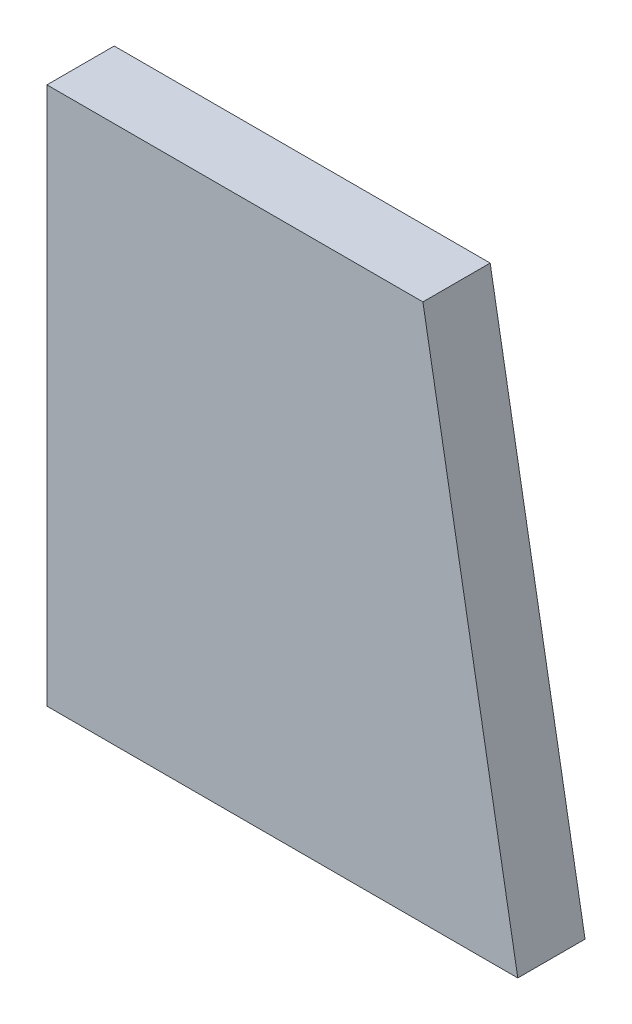
ISO-10303-21;
HEADER;
FILE_DESCRIPTION(('STEP AP214'),'2;1');
FILE_NAME('part.step','',(''),(''),'','','');
FILE_SCHEMA(('AUTOMOTIVE_DESIGN { 1 0 10303 214 1 1 1 1 }'));
ENDSEC;
DATA;
#1=APPLICATION_CONTEXT('core data for automotive mechanical design processes');
#2=APPLICATION_PROTOCOL_DEFINITION('international standard','automotive_design',2000,#1);
#3=PRODUCT_CONTEXT('',#1,'mechanical');
#4=PRODUCT('Part','Part','',(#3));
#5=PRODUCT_RELATED_PRODUCT_CATEGORY('part','',(#4));
#6=PRODUCT_DEFINITION_FORMATION('','',#4);
#7=PRODUCT_DEFINITION_CONTEXT('part definition',#1,'design');
#8=PRODUCT_DEFINITION('design','',#6,#7);
#9=PRODUCT_DEFINITION_SHAPE('','',#8);
#10=(LENGTH_UNIT() NAMED_UNIT(*) SI_UNIT(.MILLI.,.METRE.));
#11=(NAMED_UNIT(*) PLANE_ANGLE_UNIT() SI_UNIT($,.RADIAN.));
#12=(NAMED_UNIT(*) SI_UNIT($,.STERADIAN.) SOLID_ANGLE_UNIT());
#13=UNCERTAINTY_MEASURE_WITH_UNIT(LENGTH_MEASURE(1.E-05),#10,'distance_accuracy_value','');
#14=(GEOMETRIC_REPRESENTATION_CONTEXT(3) GLOBAL_UNCERTAINTY_ASSIGNED_CONTEXT((#13)) GLOBAL_UNIT_ASSIGNED_CONTEXT((#10,
#11,#12)) REPRESENTATION_CONTEXT('',''));
#15=CARTESIAN_POINT('',(0.,0.,0.));
#16=DIRECTION('',(0.,0.,1.));
#17=DIRECTION('',(1.,0.,0.));
#18=AXIS2_PLACEMENT_3D('',#15,#16,#17);
#19=CARTESIAN_POINT('',(-7.05307922833879,40.,5.));
#20=DIRECTION('',(-0.984807753012207,-0.173648177666935,0.));
#21=DIRECTION('',(0.173648177666935,-0.984807753012207,0.));
#22=AXIS2_PLACEMENT_3D('',#19,#20,#21);
#23=PLANE('',#22);
#24=DIRECTION('',(-0.173648177666935,0.984807753012207,0.));
#25=VECTOR('',#24,1.);
#26=CARTESIAN_POINT('',(-7.05307922833879,40.,0.));
#27=LINE('',#26,#25);
#28=CARTESIAN_POINT('',(0.,0.,0.));
#29=VERTEX_POINT('',#28);
#30=CARTESIAN_POINT('',(-7.05307922833879,40.,0.));
#31=VERTEX_POINT('',#30);
#32=EDGE_CURVE('E96',#29,#31,#27,.T.);
#33=ORIENTED_EDGE('',*,*,#32,.T.);
#34=DIRECTION('',(0.,0.,-1.));
#35=VECTOR('',#34,1.);
#36=CARTESIAN_POINT('',(-7.05307922833879,40.,5.));
#37=LINE('',#36,#35);
#38=CARTESIAN_POINT('',(-7.05307922833879,40.,5.));
#39=VERTEX_POINT('',#38);
#40=EDGE_CURVE('E11',#39,#31,#37,.T.);
#41=ORIENTED_EDGE('',*,*,#40,.F.);
#42=DIRECTION('',(-0.173648177666935,0.984807753012207,0.));
#43=VECTOR('',#42,1.);
#44=CARTESIAN_POINT('',(-7.05307922833879,40.,5.));
#45=LINE('',#44,#43);
#46=CARTESIAN_POINT('',(0.,0.,5.));
#47=VERTEX_POINT('',#46);
#48=EDGE_CURVE('E84',#47,#39,#45,.T.);
#49=ORIENTED_EDGE('',*,*,#48,.F.);
#50=DIRECTION('',(0.,0.,-1.));
#51=VECTOR('',#50,1.);
#52=CARTESIAN_POINT('',(0.,0.,5.));
#53=LINE('',#52,#51);
#54=EDGE_CURVE('E92',#47,#29,#53,.T.);
#55=ORIENTED_EDGE('',*,*,#54,.T.);
#56=EDGE_LOOP('',(#33,#41,#49,#55));
#57=FACE_BOUND('',#56,.T.);
#58=ADVANCED_FACE('F33',(#57),#23,.F.);
#59=CARTESIAN_POINT('',(-35.,40.,5.));
#60=DIRECTION('',(0.,-1.,0.));
#61=DIRECTION('',(0.,0.,-1.));
#62=AXIS2_PLACEMENT_3D('',#59,#60,#61);
#63=PLANE('',#62);
#64=DIRECTION('',(-1.,0.,0.));
#65=VECTOR('',#64,1.);
#66=CARTESIAN_POINT('',(-35.,40.,0.));
#67=LINE('',#66,#65);
#68=CARTESIAN_POINT('',(-35.,40.,0.));
#69=VERTEX_POINT('',#68);
#70=EDGE_CURVE('E88',#31,#69,#67,.T.);
#71=ORIENTED_EDGE('',*,*,#70,.T.);
#72=DIRECTION('',(0.,0.,-1.));
#73=VECTOR('',#72,1.);
#74=CARTESIAN_POINT('',(-35.,40.,5.));
#75=LINE('',#74,#73);
#76=CARTESIAN_POINT('',(-35.,40.,5.));
#77=VERTEX_POINT('',#76);
#78=EDGE_CURVE('E41',#77,#69,#75,.T.);
#79=ORIENTED_EDGE('',*,*,#78,.F.);
#80=DIRECTION('',(-1.,0.,0.));
#81=VECTOR('',#80,1.);
#82=CARTESIAN_POINT('',(-35.,40.,5.));
#83=LINE('',#82,#81);
#84=EDGE_CURVE('E79',#39,#77,#83,.T.);
#85=ORIENTED_EDGE('',*,*,#84,.F.);
#86=ORIENTED_EDGE('',*,*,#40,.T.);
#87=EDGE_LOOP('',(#71,#79,#85,#86));
#88=FACE_BOUND('',#87,.T.);
#89=ADVANCED_FACE('F87',(#88),#63,.F.);
#90=CARTESIAN_POINT('',(-35.,0.,5.));
#91=DIRECTION('',(1.,0.,0.));
#92=DIRECTION('',(0.,0.,-1.));
#93=AXIS2_PLACEMENT_3D('',#90,#91,#92);
#94=PLANE('',#93);
#95=DIRECTION('',(0.,-1.,0.));
#96=VECTOR('',#95,1.);
#97=CARTESIAN_POINT('',(-35.,0.,0.));
#98=LINE('',#97,#96);
#99=CARTESIAN_POINT('',(-35.,0.,0.));
#100=VERTEX_POINT('',#99);
#101=EDGE_CURVE('E66',#69,#100,#98,.T.);
#102=ORIENTED_EDGE('',*,*,#101,.T.);
#103=DIRECTION('',(0.,0.,-1.));
#104=VECTOR('',#103,1.);
#105=CARTESIAN_POINT('',(-35.,0.,5.));
#106=LINE('',#105,#104);
#107=CARTESIAN_POINT('',(-35.,0.,5.));
#108=VERTEX_POINT('',#107);
#109=EDGE_CURVE('E89',#108,#100,#106,.T.);
#110=ORIENTED_EDGE('',*,*,#109,.F.);
#111=DIRECTION('',(0.,-1.,0.));
#112=VECTOR('',#111,1.);
#113=CARTESIAN_POINT('',(-35.,0.,5.));
#114=LINE('',#113,#112);
#115=EDGE_CURVE('E82',#77,#108,#114,.T.);
#116=ORIENTED_EDGE('',*,*,#115,.F.);
#117=ORIENTED_EDGE('',*,*,#78,.T.);
#118=EDGE_LOOP('',(#102,#110,#116,#117));
#119=FACE_BOUND('',#118,.T.);
#120=ADVANCED_FACE('F90',(#119),#94,.F.);
#121=CARTESIAN_POINT('',(0.,0.,5.));
#122=DIRECTION('',(0.,1.,0.));
#123=DIRECTION('',(0.,0.,1.));
#124=AXIS2_PLACEMENT_3D('',#121,#122,#123);
#125=PLANE('',#124);
#126=DIRECTION('',(1.,0.,0.));
#127=VECTOR('',#126,1.);
#128=CARTESIAN_POINT('',(0.,0.,0.));
#129=LINE('',#128,#127);
#130=EDGE_CURVE('E72',#100,#29,#129,.T.);
#131=ORIENTED_EDGE('',*,*,#130,.T.);
#132=ORIENTED_EDGE('',*,*,#54,.F.);
#133=DIRECTION('',(1.,0.,0.));
#134=VECTOR('',#133,1.);
#135=CARTESIAN_POINT('',(0.,0.,5.));
#136=LINE('',#135,#134);
#137=EDGE_CURVE('E49',#108,#47,#136,.T.);
#138=ORIENTED_EDGE('',*,*,#137,.F.);
#139=ORIENTED_EDGE('',*,*,#109,.T.);
#140=EDGE_LOOP('',(#131,#132,#138,#139));
#141=FACE_BOUND('',#140,.T.);
#142=ADVANCED_FACE('F103',(#141),#125,.F.);
#143=CARTESIAN_POINT('',(0.,0.,5.));
#144=DIRECTION('',(0.,0.,-1.));
#145=DIRECTION('',(-1.,0.,0.));
#146=AXIS2_PLACEMENT_3D('',#143,#144,#145);
#147=PLANE('',#146);
#148=ORIENTED_EDGE('',*,*,#48,.T.);
#149=ORIENTED_EDGE('',*,*,#84,.T.);
#150=ORIENTED_EDGE('',*,*,#115,.T.);
#151=ORIENTED_EDGE('',*,*,#137,.T.);
#152=EDGE_LOOP('',(#148,#149,#150,#151));
#153=FACE_BOUND('',#152,.T.);
#154=ADVANCED_FACE('F80',(#153),#147,.F.);
#155=CARTESIAN_POINT('',(0.,0.,0.));
#156=DIRECTION('',(0.,0.,-1.));
#157=DIRECTION('',(-1.,0.,0.));
#158=AXIS2_PLACEMENT_3D('',#155,#156,#157);
#159=PLANE('',#158);
#160=ORIENTED_EDGE('',*,*,#32,.F.);
#161=ORIENTED_EDGE('',*,*,#130,.F.);
#162=ORIENTED_EDGE('',*,*,#101,.F.);
#163=ORIENTED_EDGE('',*,*,#70,.F.);
#164=EDGE_LOOP('',(#160,#161,#162,#163));
#165=FACE_BOUND('',#164,.T.);
#166=ADVANCED_FACE('F106',(#165),#159,.T.);
#167=CLOSED_SHELL('',(#58,#89,#120,#142,#154,#166));
#168=MANIFOLD_SOLID_BREP('B2',#167);
#169=ADVANCED_BREP_SHAPE_REPRESENTATION('',(#18,#168),#14);
#170=SHAPE_DEFINITION_REPRESENTATION(#9,#169);
ENDSEC;
END-ISO-10303-21;
